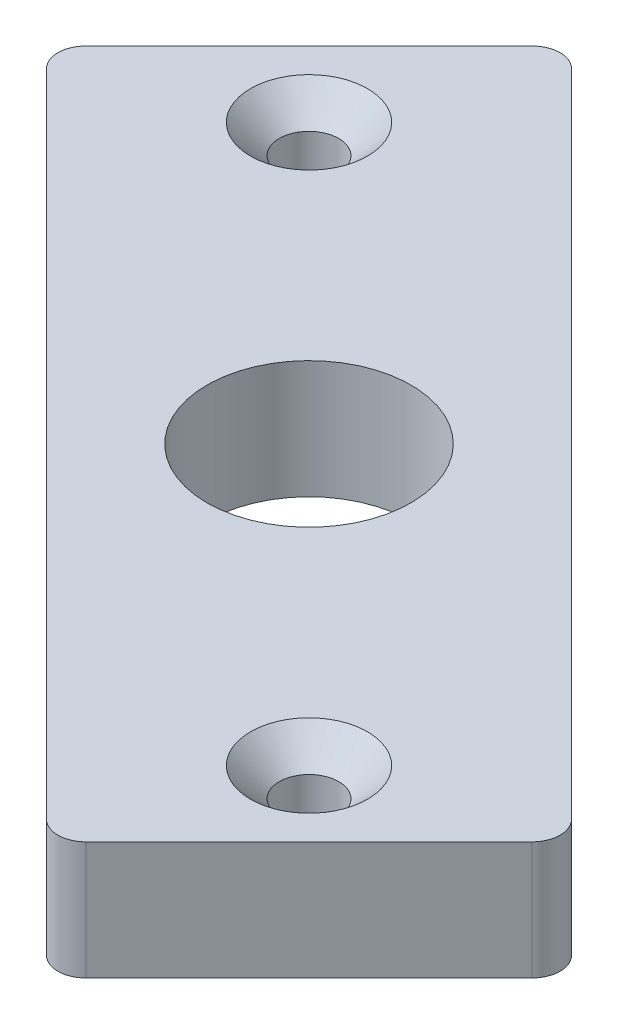
ISO-10303-21;
HEADER;
FILE_DESCRIPTION(('STEP AP214'),'2;1');
FILE_NAME('part.step','',(''),(''),'','','');
FILE_SCHEMA(('AUTOMOTIVE_DESIGN { 1 0 10303 214 1 1 1 1 }'));
ENDSEC;
DATA;
#1=APPLICATION_CONTEXT('core data for automotive mechanical design processes');
#2=APPLICATION_PROTOCOL_DEFINITION('international standard','automotive_design',2000,#1);
#3=PRODUCT_CONTEXT('',#1,'mechanical');
#4=PRODUCT('Part','Part','',(#3));
#5=PRODUCT_RELATED_PRODUCT_CATEGORY('part','',(#4));
#6=PRODUCT_DEFINITION_FORMATION('','',#4);
#7=PRODUCT_DEFINITION_CONTEXT('part definition',#1,'design');
#8=PRODUCT_DEFINITION('design','',#6,#7);
#9=PRODUCT_DEFINITION_SHAPE('','',#8);
#10=(LENGTH_UNIT() NAMED_UNIT(*) SI_UNIT(.MILLI.,.METRE.));
#11=(NAMED_UNIT(*) PLANE_ANGLE_UNIT() SI_UNIT($,.RADIAN.));
#12=(NAMED_UNIT(*) SI_UNIT($,.STERADIAN.) SOLID_ANGLE_UNIT());
#13=UNCERTAINTY_MEASURE_WITH_UNIT(LENGTH_MEASURE(1.E-05),#10,'distance_accuracy_value','');
#14=(GEOMETRIC_REPRESENTATION_CONTEXT(3) GLOBAL_UNCERTAINTY_ASSIGNED_CONTEXT((#13)) GLOBAL_UNIT_ASSIGNED_CONTEXT((#10,
#11,#12)) REPRESENTATION_CONTEXT('',''));
#15=CARTESIAN_POINT('',(0.,0.,0.));
#16=DIRECTION('',(0.,0.,1.));
#17=DIRECTION('',(1.,0.,0.));
#18=AXIS2_PLACEMENT_3D('',#15,#16,#17);
#19=CARTESIAN_POINT('',(0.,-12.7,0.));
#20=DIRECTION('',(0.,-1.,0.));
#21=DIRECTION('',(0.,0.,-1.));
#22=AXIS2_PLACEMENT_3D('',#19,#20,#21);
#23=PLANE('',#22);
#24=CARTESIAN_POINT('',(-30.,-12.7,-30.));
#25=DIRECTION('',(0.,1.,0.));
#26=DIRECTION('',(0.,0.,1.));
#27=AXIS2_PLACEMENT_3D('',#24,#25,#26);
#28=CIRCLE('',#27,3.2);
#29=CARTESIAN_POINT('',(-30.,-12.7,-26.8));
#30=VERTEX_POINT('',#29);
#31=EDGE_CURVE('E355',#30,#30,#28,.T.);
#32=ORIENTED_EDGE('',*,*,#31,.T.);
#33=EDGE_LOOP('',(#32));
#34=FACE_BOUND('',#33,.T.);
#35=DIRECTION('',(0.707106781186548,0.,-0.707106781186548));
#36=VECTOR('',#35,1.);
#37=CARTESIAN_POINT('',(22.9809703885628,-12.7,51.2652416360247));
#38=LINE('',#37,#36);
#39=CARTESIAN_POINT('',(25.1022907321224,-12.7,49.143921292465));
#40=VERTEX_POINT('',#39);
#41=CARTESIAN_POINT('',(49.1439212924651,-12.7,25.1022907321224));
#42=VERTEX_POINT('',#41);
#43=EDGE_CURVE('E138',#40,#42,#38,.T.);
#44=ORIENTED_EDGE('',*,*,#43,.F.);
#45=CARTESIAN_POINT('',(22.9809703885627,-12.7,47.0226009489054));
#46=DIRECTION('',(0.,-1.,0.));
#47=DIRECTION('',(0.,0.,-1.));
#48=AXIS2_PLACEMENT_3D('',#45,#46,#47);
#49=CIRCLE('',#48,3.);
#50=CARTESIAN_POINT('',(20.8596500450031,-12.7,49.143921292465));
#51=VERTEX_POINT('',#50);
#52=EDGE_CURVE('E166',#40,#51,#49,.T.);
#53=ORIENTED_EDGE('',*,*,#52,.T.);
#54=DIRECTION('',(0.707106781186548,0.,0.707106781186548));
#55=VECTOR('',#54,1.);
#56=CARTESIAN_POINT('',(-51.2652416360247,-12.7,-22.9809703885628));
#57=LINE('',#56,#55);
#58=CARTESIAN_POINT('',(-49.1439212924651,-12.7,-20.8596500450032));
#59=VERTEX_POINT('',#58);
#60=EDGE_CURVE('E181',#59,#51,#57,.T.);
#61=ORIENTED_EDGE('',*,*,#60,.F.);
#62=CARTESIAN_POINT('',(-47.0226009489054,-12.7,-22.9809703885628));
#63=DIRECTION('',(0.,-1.,0.));
#64=DIRECTION('',(0.,0.,-1.));
#65=AXIS2_PLACEMENT_3D('',#62,#63,#64);
#66=CIRCLE('',#65,3.);
#67=CARTESIAN_POINT('',(-49.1439212924651,-12.7,-25.1022907321224));
#68=VERTEX_POINT('',#67);
#69=EDGE_CURVE('E131',#59,#68,#66,.T.);
#70=ORIENTED_EDGE('',*,*,#69,.T.);
#71=DIRECTION('',(-0.707106781186548,0.,0.707106781186547));
#72=VECTOR('',#71,1.);
#73=CARTESIAN_POINT('',(-51.2652416360247,-12.7,-22.9809703885628));
#74=LINE('',#73,#72);
#75=CARTESIAN_POINT('',(-25.1022907321224,-12.7,-49.1439212924651));
#76=VERTEX_POINT('',#75);
#77=EDGE_CURVE('E179',#76,#68,#74,.T.);
#78=ORIENTED_EDGE('',*,*,#77,.F.);
#79=CARTESIAN_POINT('',(-22.9809703885628,-12.7,-47.0226009489054));
#80=DIRECTION('',(0.,-1.,0.));
#81=DIRECTION('',(0.,0.,-1.));
#82=AXIS2_PLACEMENT_3D('',#79,#80,#81);
#83=CIRCLE('',#82,3.);
#84=CARTESIAN_POINT('',(-20.8596500450032,-12.7,-49.1439212924651));
#85=VERTEX_POINT('',#84);
#86=EDGE_CURVE('E55',#76,#85,#83,.T.);
#87=ORIENTED_EDGE('',*,*,#86,.T.);
#88=DIRECTION('',(-0.707106781186548,0.,-0.707106781186547));
#89=VECTOR('',#88,1.);
#90=CARTESIAN_POINT('',(-22.9809703885628,-12.7,-51.2652416360247));
#91=LINE('',#90,#89);
#92=CARTESIAN_POINT('',(49.143921292465,-12.7,20.8596500450031));
#93=VERTEX_POINT('',#92);
#94=EDGE_CURVE('E133',#93,#85,#91,.T.);
#95=ORIENTED_EDGE('',*,*,#94,.F.);
#96=CARTESIAN_POINT('',(47.0226009489054,-12.7,22.9809703885628));
#97=DIRECTION('',(0.,-1.,0.));
#98=DIRECTION('',(0.,0.,-1.));
#99=AXIS2_PLACEMENT_3D('',#96,#97,#98);
#100=CIRCLE('',#99,3.);
#101=EDGE_CURVE('E163',#93,#42,#100,.T.);
#102=ORIENTED_EDGE('',*,*,#101,.T.);
#103=EDGE_LOOP('',(#44,#53,#61,#70,#78,#87,#95,#102));
#104=FACE_BOUND('',#103,.T.);
#105=CARTESIAN_POINT('',(0.,-12.7,0.));
#106=DIRECTION('',(0.,1.,0.));
#107=DIRECTION('',(0.,0.,1.));
#108=AXIS2_PLACEMENT_3D('',#105,#106,#107);
#109=CIRCLE('',#108,10.993);
#110=CARTESIAN_POINT('',(0.,-12.7,10.993));
#111=VERTEX_POINT('',#110);
#112=EDGE_CURVE('E195',#111,#111,#109,.T.);
#113=ORIENTED_EDGE('',*,*,#112,.T.);
#114=EDGE_LOOP('',(#113));
#115=FACE_BOUND('',#114,.T.);
#116=CARTESIAN_POINT('',(30.,-12.7,30.));
#117=DIRECTION('',(0.,1.,0.));
#118=DIRECTION('',(0.,0.,1.));
#119=AXIS2_PLACEMENT_3D('',#116,#117,#118);
#120=CIRCLE('',#119,3.2);
#121=CARTESIAN_POINT('',(30.,-12.7,33.2));
#122=VERTEX_POINT('',#121);
#123=EDGE_CURVE('E368',#122,#122,#120,.T.);
#124=ORIENTED_EDGE('',*,*,#123,.T.);
#125=EDGE_LOOP('',(#124));
#126=FACE_BOUND('',#125,.T.);
#127=ADVANCED_FACE('F39',(#34,#104,#115,#126),#23,.T.);
#128=CARTESIAN_POINT('',(-51.2652416360247,-12.7,-22.9809703885628));
#129=DIRECTION('',(-0.707106781186547,0.,-0.707106781186548));
#130=DIRECTION('',(-0.707106781186548,0.,0.707106781186547));
#131=AXIS2_PLACEMENT_3D('',#128,#129,#130);
#132=PLANE('',#131);
#133=DIRECTION('',(-0.707106781186548,0.,0.707106781186547));
#134=VECTOR('',#133,1.);
#135=CARTESIAN_POINT('',(-51.2652416360247,0.,-22.9809703885628));
#136=LINE('',#135,#134);
#137=CARTESIAN_POINT('',(-25.1022907321224,0.,-49.1439212924651));
#138=VERTEX_POINT('',#137);
#139=CARTESIAN_POINT('',(-49.1439212924651,0.,-25.1022907321224));
#140=VERTEX_POINT('',#139);
#141=EDGE_CURVE('E111',#138,#140,#136,.T.);
#142=ORIENTED_EDGE('',*,*,#141,.F.);
#143=DIRECTION('',(0.,1.,0.));
#144=VECTOR('',#143,1.);
#145=CARTESIAN_POINT('',(-25.1022907321224,-12.7,-49.1439212924651));
#146=LINE('',#145,#144);
#147=EDGE_CURVE('E11',#138,#76,#146,.F.);
#148=ORIENTED_EDGE('',*,*,#147,.T.);
#149=ORIENTED_EDGE('',*,*,#77,.T.);
#150=DIRECTION('',(0.,1.,0.));
#151=VECTOR('',#150,1.);
#152=CARTESIAN_POINT('',(-49.1439212924651,-12.7,-25.1022907321224));
#153=LINE('',#152,#151);
#154=EDGE_CURVE('E48',#68,#140,#153,.T.);
#155=ORIENTED_EDGE('',*,*,#154,.T.);
#156=EDGE_LOOP('',(#142,#148,#149,#155));
#157=FACE_BOUND('',#156,.T.);
#158=ADVANCED_FACE('F177',(#157),#132,.T.);
#159=CARTESIAN_POINT('',(-22.9809703885628,-12.7,-51.2652416360247));
#160=DIRECTION('',(0.707106781186547,0.,-0.707106781186548));
#161=DIRECTION('',(-0.707106781186548,0.,-0.707106781186547));
#162=AXIS2_PLACEMENT_3D('',#159,#160,#161);
#163=PLANE('',#162);
#164=DIRECTION('',(-0.707106781186548,0.,-0.707106781186547));
#165=VECTOR('',#164,1.);
#166=CARTESIAN_POINT('',(-22.9809703885628,0.,-51.2652416360247));
#167=LINE('',#166,#165);
#168=CARTESIAN_POINT('',(49.143921292465,0.,20.8596500450031));
#169=VERTEX_POINT('',#168);
#170=CARTESIAN_POINT('',(-20.8596500450032,0.,-49.1439212924651));
#171=VERTEX_POINT('',#170);
#172=EDGE_CURVE('E141',#169,#171,#167,.T.);
#173=ORIENTED_EDGE('',*,*,#172,.F.);
#174=DIRECTION('',(0.,1.,0.));
#175=VECTOR('',#174,1.);
#176=CARTESIAN_POINT('',(49.143921292465,-12.7,20.8596500450031));
#177=LINE('',#176,#175);
#178=EDGE_CURVE('E62',#169,#93,#177,.F.);
#179=ORIENTED_EDGE('',*,*,#178,.T.);
#180=ORIENTED_EDGE('',*,*,#94,.T.);
#181=DIRECTION('',(0.,1.,0.));
#182=VECTOR('',#181,1.);
#183=CARTESIAN_POINT('',(-20.8596500450032,-12.7,-49.1439212924651));
#184=LINE('',#183,#182);
#185=EDGE_CURVE('E169',#85,#171,#184,.T.);
#186=ORIENTED_EDGE('',*,*,#185,.T.);
#187=EDGE_LOOP('',(#173,#179,#180,#186));
#188=FACE_BOUND('',#187,.T.);
#189=ADVANCED_FACE('F227',(#188),#163,.T.);
#190=CARTESIAN_POINT('',(22.9809703885628,-12.7,51.2652416360247));
#191=DIRECTION('',(0.707106781186548,0.,0.707106781186548));
#192=DIRECTION('',(0.707106781186548,0.,-0.707106781186548));
#193=AXIS2_PLACEMENT_3D('',#190,#191,#192);
#194=PLANE('',#193);
#195=DIRECTION('',(0.707106781186548,0.,-0.707106781186548));
#196=VECTOR('',#195,1.);
#197=CARTESIAN_POINT('',(22.9809703885628,0.,51.2652416360247));
#198=LINE('',#197,#196);
#199=CARTESIAN_POINT('',(25.1022907321224,0.,49.143921292465));
#200=VERTEX_POINT('',#199);
#201=CARTESIAN_POINT('',(49.1439212924651,0.,25.1022907321224));
#202=VERTEX_POINT('',#201);
#203=EDGE_CURVE('E128',#200,#202,#198,.T.);
#204=ORIENTED_EDGE('',*,*,#203,.F.);
#205=DIRECTION('',(0.,1.,0.));
#206=VECTOR('',#205,1.);
#207=CARTESIAN_POINT('',(25.1022907321224,-12.7,49.143921292465));
#208=LINE('',#207,#206);
#209=EDGE_CURVE('E156',#200,#40,#208,.F.);
#210=ORIENTED_EDGE('',*,*,#209,.T.);
#211=ORIENTED_EDGE('',*,*,#43,.T.);
#212=DIRECTION('',(0.,1.,0.));
#213=VECTOR('',#212,1.);
#214=CARTESIAN_POINT('',(49.143921292465,-12.7,25.1022907321224));
#215=LINE('',#214,#213);
#216=EDGE_CURVE('E152',#42,#202,#215,.T.);
#217=ORIENTED_EDGE('',*,*,#216,.T.);
#218=EDGE_LOOP('',(#204,#210,#211,#217));
#219=FACE_BOUND('',#218,.T.);
#220=ADVANCED_FACE('F201',(#219),#194,.T.);
#221=CARTESIAN_POINT('',(-51.2652416360247,-12.7,-22.9809703885628));
#222=DIRECTION('',(-0.707106781186548,0.,0.707106781186548));
#223=DIRECTION('',(0.707106781186548,0.,0.707106781186548));
#224=AXIS2_PLACEMENT_3D('',#221,#222,#223);
#225=PLANE('',#224);
#226=ORIENTED_EDGE('',*,*,#60,.T.);
#227=DIRECTION('',(0.,1.,0.));
#228=VECTOR('',#227,1.);
#229=CARTESIAN_POINT('',(20.8596500450031,-12.7,49.143921292465));
#230=LINE('',#229,#228);
#231=CARTESIAN_POINT('',(20.8596500450031,0.,49.143921292465));
#232=VERTEX_POINT('',#231);
#233=EDGE_CURVE('E118',#51,#232,#230,.T.);
#234=ORIENTED_EDGE('',*,*,#233,.T.);
#235=DIRECTION('',(0.707106781186548,0.,0.707106781186548));
#236=VECTOR('',#235,1.);
#237=CARTESIAN_POINT('',(-51.2652416360247,0.,-22.9809703885628));
#238=LINE('',#237,#236);
#239=CARTESIAN_POINT('',(-49.1439212924651,0.,-20.8596500450032));
#240=VERTEX_POINT('',#239);
#241=EDGE_CURVE('E109',#240,#232,#238,.T.);
#242=ORIENTED_EDGE('',*,*,#241,.F.);
#243=DIRECTION('',(0.,1.,0.));
#244=VECTOR('',#243,1.);
#245=CARTESIAN_POINT('',(-49.1439212924651,-12.7,-20.8596500450032));
#246=LINE('',#245,#244);
#247=EDGE_CURVE('E124',#240,#59,#246,.F.);
#248=ORIENTED_EDGE('',*,*,#247,.T.);
#249=EDGE_LOOP('',(#226,#234,#242,#248));
#250=FACE_BOUND('',#249,.T.);
#251=ADVANCED_FACE('F123',(#250),#225,.T.);
#252=CARTESIAN_POINT('',(0.,0.,0.));
#253=DIRECTION('',(0.,-1.,0.));
#254=DIRECTION('',(0.,0.,-1.));
#255=AXIS2_PLACEMENT_3D('',#252,#253,#254);
#256=PLANE('',#255);
#257=CARTESIAN_POINT('',(-30.,0.,-30.));
#258=DIRECTION('',(0.,1.,0.));
#259=DIRECTION('',(0.,0.,1.));
#260=AXIS2_PLACEMENT_3D('',#257,#258,#259);
#261=CIRCLE('',#260,6.3);
#262=CARTESIAN_POINT('',(-30.,0.,-23.7));
#263=VERTEX_POINT('',#262);
#264=EDGE_CURVE('E351',#263,#263,#261,.T.);
#265=ORIENTED_EDGE('',*,*,#264,.F.);
#266=EDGE_LOOP('',(#265));
#267=FACE_BOUND('',#266,.T.);
#268=CARTESIAN_POINT('',(30.,0.,30.));
#269=DIRECTION('',(0.,1.,0.));
#270=DIRECTION('',(0.,0.,1.));
#271=AXIS2_PLACEMENT_3D('',#268,#269,#270);
#272=CIRCLE('',#271,6.3);
#273=CARTESIAN_POINT('',(30.,0.,36.3));
#274=VERTEX_POINT('',#273);
#275=EDGE_CURVE('E360',#274,#274,#272,.T.);
#276=ORIENTED_EDGE('',*,*,#275,.F.);
#277=EDGE_LOOP('',(#276));
#278=FACE_BOUND('',#277,.T.);
#279=CARTESIAN_POINT('',(0.,0.,0.));
#280=DIRECTION('',(0.,1.,0.));
#281=DIRECTION('',(0.,0.,1.));
#282=AXIS2_PLACEMENT_3D('',#279,#280,#281);
#283=CIRCLE('',#282,10.993);
#284=CARTESIAN_POINT('',(0.,0.,10.993));
#285=VERTEX_POINT('',#284);
#286=EDGE_CURVE('E188',#285,#285,#283,.T.);
#287=ORIENTED_EDGE('',*,*,#286,.F.);
#288=EDGE_LOOP('',(#287));
#289=FACE_BOUND('',#288,.T.);
#290=ORIENTED_EDGE('',*,*,#241,.T.);
#291=CARTESIAN_POINT('',(22.9809703885627,0.,47.0226009489054));
#292=DIRECTION('',(0.,-1.,0.));
#293=DIRECTION('',(0.,0.,-1.));
#294=AXIS2_PLACEMENT_3D('',#291,#292,#293);
#295=CIRCLE('',#294,3.);
#296=EDGE_CURVE('E149',#232,#200,#295,.F.);
#297=ORIENTED_EDGE('',*,*,#296,.T.);
#298=ORIENTED_EDGE('',*,*,#203,.T.);
#299=CARTESIAN_POINT('',(47.0226009489054,0.,22.9809703885628));
#300=DIRECTION('',(0.,-1.,0.));
#301=DIRECTION('',(0.,0.,-1.));
#302=AXIS2_PLACEMENT_3D('',#299,#300,#301);
#303=CIRCLE('',#302,3.);
#304=EDGE_CURVE('E146',#202,#169,#303,.F.);
#305=ORIENTED_EDGE('',*,*,#304,.T.);
#306=ORIENTED_EDGE('',*,*,#172,.T.);
#307=CARTESIAN_POINT('',(-22.9809703885628,0.,-47.0226009489054));
#308=DIRECTION('',(0.,-1.,0.));
#309=DIRECTION('',(0.,0.,-1.));
#310=AXIS2_PLACEMENT_3D('',#307,#308,#309);
#311=CIRCLE('',#310,3.);
#312=EDGE_CURVE('E117',#171,#138,#311,.F.);
#313=ORIENTED_EDGE('',*,*,#312,.T.);
#314=ORIENTED_EDGE('',*,*,#141,.T.);
#315=CARTESIAN_POINT('',(-47.0226009489054,0.,-22.9809703885628));
#316=DIRECTION('',(0.,-1.,0.));
#317=DIRECTION('',(0.,0.,-1.));
#318=AXIS2_PLACEMENT_3D('',#315,#316,#317);
#319=CIRCLE('',#318,3.);
#320=EDGE_CURVE('E106',#140,#240,#319,.F.);
#321=ORIENTED_EDGE('',*,*,#320,.T.);
#322=EDGE_LOOP('',(#290,#297,#298,#305,#306,#313,#314,#321));
#323=FACE_BOUND('',#322,.T.);
#324=ADVANCED_FACE('F108',(#267,#278,#289,#323),#256,.F.);
#325=CARTESIAN_POINT('',(0.,-12.7,0.));
#326=DIRECTION('',(0.,1.,0.));
#327=DIRECTION('',(0.,0.,1.));
#328=AXIS2_PLACEMENT_3D('',#325,#326,#327);
#329=CYLINDRICAL_SURFACE('',#328,10.993);
#330=ORIENTED_EDGE('',*,*,#112,.F.);
#331=EDGE_LOOP('',(#330));
#332=FACE_BOUND('',#331,.T.);
#333=ORIENTED_EDGE('',*,*,#286,.T.);
#334=EDGE_LOOP('',(#333));
#335=FACE_BOUND('',#334,.T.);
#336=ADVANCED_FACE('F232',(#332,#335),#329,.F.);
#337=CARTESIAN_POINT('',(30.,0.,30.));
#338=DIRECTION('',(0.,1.,0.));
#339=DIRECTION('',(0.,0.,1.));
#340=AXIS2_PLACEMENT_3D('',#337,#338,#339);
#341=CYLINDRICAL_SURFACE('',#340,3.2);
#342=ORIENTED_EDGE('',*,*,#123,.F.);
#343=EDGE_LOOP('',(#342));
#344=FACE_BOUND('',#343,.T.);
#345=CARTESIAN_POINT('',(30.,-3.1,30.));
#346=DIRECTION('',(0.,1.,0.));
#347=DIRECTION('',(0.,0.,1.));
#348=AXIS2_PLACEMENT_3D('',#345,#346,#347);
#349=CIRCLE('',#348,3.2);
#350=CARTESIAN_POINT('',(30.,-3.1,33.2));
#351=VERTEX_POINT('',#350);
#352=EDGE_CURVE('E364',#351,#351,#349,.T.);
#353=ORIENTED_EDGE('',*,*,#352,.T.);
#354=EDGE_LOOP('',(#353));
#355=FACE_BOUND('',#354,.T.);
#356=ADVANCED_FACE('F257',(#344,#355),#341,.F.);
#357=CARTESIAN_POINT('',(30.,0.,30.));
#358=DIRECTION('',(0.,1.,0.));
#359=DIRECTION('',(0.,0.,1.));
#360=AXIS2_PLACEMENT_3D('',#357,#358,#359);
#361=CONICAL_SURFACE('',#360,6.3,0.785398163397448);
#362=ORIENTED_EDGE('',*,*,#352,.F.);
#363=EDGE_LOOP('',(#362));
#364=FACE_BOUND('',#363,.T.);
#365=ORIENTED_EDGE('',*,*,#275,.T.);
#366=EDGE_LOOP('',(#365));
#367=FACE_BOUND('',#366,.T.);
#368=ADVANCED_FACE('F264',(#364,#367),#361,.F.);
#369=CARTESIAN_POINT('',(-30.,0.,-30.));
#370=DIRECTION('',(0.,1.,0.));
#371=DIRECTION('',(0.,0.,1.));
#372=AXIS2_PLACEMENT_3D('',#369,#370,#371);
#373=CYLINDRICAL_SURFACE('',#372,3.2);
#374=ORIENTED_EDGE('',*,*,#31,.F.);
#375=EDGE_LOOP('',(#374));
#376=FACE_BOUND('',#375,.T.);
#377=CARTESIAN_POINT('',(-30.,-3.1,-30.));
#378=DIRECTION('',(0.,1.,0.));
#379=DIRECTION('',(0.,0.,1.));
#380=AXIS2_PLACEMENT_3D('',#377,#378,#379);
#381=CIRCLE('',#380,3.2);
#382=CARTESIAN_POINT('',(-30.,-3.1,-26.8));
#383=VERTEX_POINT('',#382);
#384=EDGE_CURVE('E348',#383,#383,#381,.T.);
#385=ORIENTED_EDGE('',*,*,#384,.T.);
#386=EDGE_LOOP('',(#385));
#387=FACE_BOUND('',#386,.T.);
#388=ADVANCED_FACE('F271',(#376,#387),#373,.F.);
#389=CARTESIAN_POINT('',(-30.,0.,-30.));
#390=DIRECTION('',(0.,1.,0.));
#391=DIRECTION('',(0.,0.,1.));
#392=AXIS2_PLACEMENT_3D('',#389,#390,#391);
#393=CONICAL_SURFACE('',#392,6.3,0.785398163397449);
#394=ORIENTED_EDGE('',*,*,#384,.F.);
#395=EDGE_LOOP('',(#394));
#396=FACE_BOUND('',#395,.T.);
#397=ORIENTED_EDGE('',*,*,#264,.T.);
#398=EDGE_LOOP('',(#397));
#399=FACE_BOUND('',#398,.T.);
#400=ADVANCED_FACE('F219',(#396,#399),#393,.F.);
#401=CARTESIAN_POINT('',(22.9809703885627,-12.7,47.0226009489054));
#402=DIRECTION('',(0.,1.,0.));
#403=DIRECTION('',(0.,0.,1.));
#404=AXIS2_PLACEMENT_3D('',#401,#402,#403);
#405=CYLINDRICAL_SURFACE('',#404,3.);
#406=ORIENTED_EDGE('',*,*,#52,.F.);
#407=ORIENTED_EDGE('',*,*,#209,.F.);
#408=ORIENTED_EDGE('',*,*,#296,.F.);
#409=ORIENTED_EDGE('',*,*,#233,.F.);
#410=EDGE_LOOP('',(#406,#407,#408,#409));
#411=FACE_BOUND('',#410,.T.);
#412=ADVANCED_FACE('F206',(#411),#405,.T.);
#413=CARTESIAN_POINT('',(47.0226009489054,-12.7,22.9809703885628));
#414=DIRECTION('',(0.,1.,0.));
#415=DIRECTION('',(0.,0.,1.));
#416=AXIS2_PLACEMENT_3D('',#413,#414,#415);
#417=CYLINDRICAL_SURFACE('',#416,3.);
#418=ORIENTED_EDGE('',*,*,#101,.F.);
#419=ORIENTED_EDGE('',*,*,#178,.F.);
#420=ORIENTED_EDGE('',*,*,#304,.F.);
#421=ORIENTED_EDGE('',*,*,#216,.F.);
#422=EDGE_LOOP('',(#418,#419,#420,#421));
#423=FACE_BOUND('',#422,.T.);
#424=ADVANCED_FACE('F210',(#423),#417,.T.);
#425=CARTESIAN_POINT('',(-22.9809703885628,-12.7,-47.0226009489054));
#426=DIRECTION('',(0.,1.,0.));
#427=DIRECTION('',(0.,0.,1.));
#428=AXIS2_PLACEMENT_3D('',#425,#426,#427);
#429=CYLINDRICAL_SURFACE('',#428,3.);
#430=ORIENTED_EDGE('',*,*,#86,.F.);
#431=ORIENTED_EDGE('',*,*,#147,.F.);
#432=ORIENTED_EDGE('',*,*,#312,.F.);
#433=ORIENTED_EDGE('',*,*,#185,.F.);
#434=EDGE_LOOP('',(#430,#431,#432,#433));
#435=FACE_BOUND('',#434,.T.);
#436=ADVANCED_FACE('F212',(#435),#429,.T.);
#437=CARTESIAN_POINT('',(-47.0226009489054,-12.7,-22.9809703885628));
#438=DIRECTION('',(0.,1.,0.));
#439=DIRECTION('',(0.,0.,1.));
#440=AXIS2_PLACEMENT_3D('',#437,#438,#439);
#441=CYLINDRICAL_SURFACE('',#440,3.);
#442=ORIENTED_EDGE('',*,*,#69,.F.);
#443=ORIENTED_EDGE('',*,*,#247,.F.);
#444=ORIENTED_EDGE('',*,*,#320,.F.);
#445=ORIENTED_EDGE('',*,*,#154,.F.);
#446=EDGE_LOOP('',(#442,#443,#444,#445));
#447=FACE_BOUND('',#446,.T.);
#448=ADVANCED_FACE('F41',(#447),#441,.T.);
#449=CLOSED_SHELL('',(#127,#158,#189,#220,#251,#324,#336,#356,#368,#388,#400,#412,#424,#436,#448));
#450=MANIFOLD_SOLID_BREP('B2',#449);
#451=ADVANCED_BREP_SHAPE_REPRESENTATION('',(#18,#450),#14);
#452=SHAPE_DEFINITION_REPRESENTATION(#9,#451);
ENDSEC;
END-ISO-10303-21;
